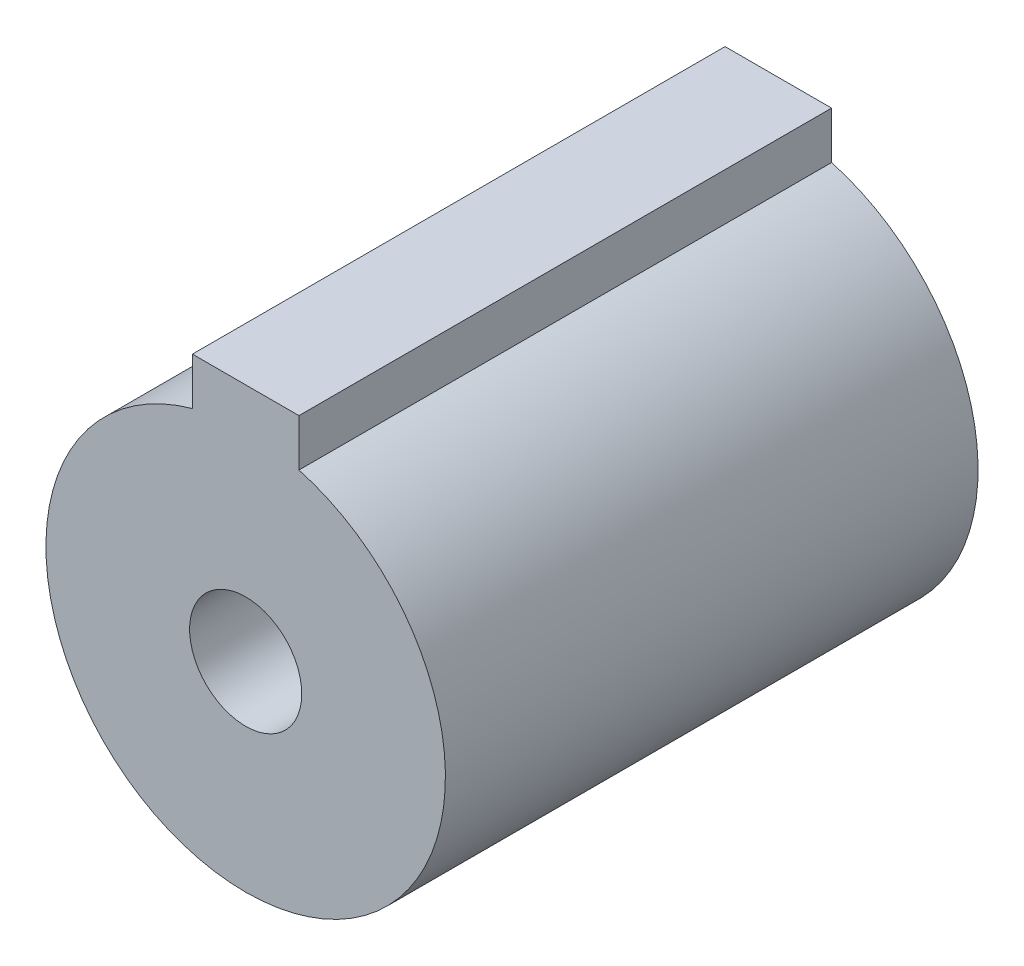
ISO-10303-21;
HEADER;
FILE_DESCRIPTION(('STEP AP214'),'2;1');
FILE_NAME('part.step','',(''),(''),'','','');
FILE_SCHEMA(('AUTOMOTIVE_DESIGN { 1 0 10303 214 1 1 1 1 }'));
ENDSEC;
DATA;
#1=APPLICATION_CONTEXT('core data for automotive mechanical design processes');
#2=APPLICATION_PROTOCOL_DEFINITION('international standard','automotive_design',2000,#1);
#3=PRODUCT_CONTEXT('',#1,'mechanical');
#4=PRODUCT('Part','Part','',(#3));
#5=PRODUCT_RELATED_PRODUCT_CATEGORY('part','',(#4));
#6=PRODUCT_DEFINITION_FORMATION('','',#4);
#7=PRODUCT_DEFINITION_CONTEXT('part definition',#1,'design');
#8=PRODUCT_DEFINITION('design','',#6,#7);
#9=PRODUCT_DEFINITION_SHAPE('','',#8);
#10=(LENGTH_UNIT() NAMED_UNIT(*) SI_UNIT(.MILLI.,.METRE.));
#11=(NAMED_UNIT(*) PLANE_ANGLE_UNIT() SI_UNIT($,.RADIAN.));
#12=(NAMED_UNIT(*) SI_UNIT($,.STERADIAN.) SOLID_ANGLE_UNIT());
#13=UNCERTAINTY_MEASURE_WITH_UNIT(LENGTH_MEASURE(1.E-05),#10,'distance_accuracy_value','');
#14=(GEOMETRIC_REPRESENTATION_CONTEXT(3) GLOBAL_UNCERTAINTY_ASSIGNED_CONTEXT((#13)) GLOBAL_UNIT_ASSIGNED_CONTEXT((#10,
#11,#12)) REPRESENTATION_CONTEXT('',''));
#15=CARTESIAN_POINT('',(0.,0.,0.));
#16=DIRECTION('',(0.,0.,1.));
#17=DIRECTION('',(1.,0.,0.));
#18=AXIS2_PLACEMENT_3D('',#15,#16,#17);
#19=CARTESIAN_POINT('',(-4.,14.456832294801,40.));
#20=DIRECTION('',(1.,0.,0.));
#21=DIRECTION('',(0.,0.,-1.));
#22=AXIS2_PLACEMENT_3D('',#19,#20,#21);
#23=PLANE('',#22);
#24=DIRECTION('',(0.,-1.,0.));
#25=VECTOR('',#24,1.);
#26=CARTESIAN_POINT('',(-4.,14.456832294801,0.));
#27=LINE('',#26,#25);
#28=CARTESIAN_POINT('',(-4.,17.996832294801,0.));
#29=VERTEX_POINT('',#28);
#30=CARTESIAN_POINT('',(-4.,14.456832294801,0.));
#31=VERTEX_POINT('',#30);
#32=EDGE_CURVE('E101',#29,#31,#27,.T.);
#33=ORIENTED_EDGE('',*,*,#32,.T.);
#34=DIRECTION('',(0.,0.,-1.));
#35=VECTOR('',#34,1.);
#36=CARTESIAN_POINT('',(-4.,14.456832294801,40.));
#37=LINE('',#36,#35);
#38=CARTESIAN_POINT('',(-4.,14.456832294801,40.));
#39=VERTEX_POINT('',#38);
#40=EDGE_CURVE('E11',#39,#31,#37,.T.);
#41=ORIENTED_EDGE('',*,*,#40,.F.);
#42=DIRECTION('',(0.,-1.,0.));
#43=VECTOR('',#42,1.);
#44=CARTESIAN_POINT('',(-4.,14.456832294801,40.));
#45=LINE('',#44,#43);
#46=CARTESIAN_POINT('',(-4.,17.996832294801,40.));
#47=VERTEX_POINT('',#46);
#48=EDGE_CURVE('E89',#47,#39,#45,.T.);
#49=ORIENTED_EDGE('',*,*,#48,.F.);
#50=DIRECTION('',(0.,0.,-1.));
#51=VECTOR('',#50,1.);
#52=CARTESIAN_POINT('',(-4.,17.996832294801,40.));
#53=LINE('',#52,#51);
#54=EDGE_CURVE('E97',#47,#29,#53,.T.);
#55=ORIENTED_EDGE('',*,*,#54,.T.);
#56=EDGE_LOOP('',(#33,#41,#49,#55));
#57=FACE_BOUND('',#56,.T.);
#58=ADVANCED_FACE('F38',(#57),#23,.F.);
#59=CARTESIAN_POINT('',(0.,0.,40.));
#60=DIRECTION('',(0.,0.,-1.));
#61=DIRECTION('',(-1.,0.,0.));
#62=AXIS2_PLACEMENT_3D('',#59,#60,#61);
#63=CYLINDRICAL_SURFACE('',#62,15.);
#64=CARTESIAN_POINT('',(0.,0.,0.));
#65=DIRECTION('',(0.,0.,1.));
#66=DIRECTION('',(1.,0.,0.));
#67=AXIS2_PLACEMENT_3D('',#64,#65,#66);
#68=CIRCLE('',#67,15.);
#69=CARTESIAN_POINT('',(4.,14.456832294801,0.));
#70=VERTEX_POINT('',#69);
#71=EDGE_CURVE('E93',#31,#70,#68,.T.);
#72=ORIENTED_EDGE('',*,*,#71,.T.);
#73=DIRECTION('',(0.,0.,-1.));
#74=VECTOR('',#73,1.);
#75=CARTESIAN_POINT('',(4.,14.456832294801,40.));
#76=LINE('',#75,#74);
#77=CARTESIAN_POINT('',(4.,14.456832294801,40.));
#78=VERTEX_POINT('',#77);
#79=EDGE_CURVE('E46',#78,#70,#76,.T.);
#80=ORIENTED_EDGE('',*,*,#79,.F.);
#81=CARTESIAN_POINT('',(0.,0.,40.));
#82=DIRECTION('',(0.,0.,1.));
#83=DIRECTION('',(1.,0.,0.));
#84=AXIS2_PLACEMENT_3D('',#81,#82,#83);
#85=CIRCLE('',#84,15.);
#86=EDGE_CURVE('E84',#39,#78,#85,.T.);
#87=ORIENTED_EDGE('',*,*,#86,.F.);
#88=ORIENTED_EDGE('',*,*,#40,.T.);
#89=EDGE_LOOP('',(#72,#80,#87,#88));
#90=FACE_BOUND('',#89,.T.);
#91=ADVANCED_FACE('F92',(#90),#63,.T.);
#92=CARTESIAN_POINT('',(4.,14.456832294801,40.));
#93=DIRECTION('',(-1.,0.,0.));
#94=DIRECTION('',(0.,0.,1.));
#95=AXIS2_PLACEMENT_3D('',#92,#93,#94);
#96=PLANE('',#95);
#97=DIRECTION('',(0.,1.,0.));
#98=VECTOR('',#97,1.);
#99=CARTESIAN_POINT('',(4.,14.456832294801,0.));
#100=LINE('',#99,#98);
#101=CARTESIAN_POINT('',(4.,17.996832294801,0.));
#102=VERTEX_POINT('',#101);
#103=EDGE_CURVE('E71',#70,#102,#100,.T.);
#104=ORIENTED_EDGE('',*,*,#103,.T.);
#105=DIRECTION('',(0.,0.,-1.));
#106=VECTOR('',#105,1.);
#107=CARTESIAN_POINT('',(4.,17.996832294801,40.));
#108=LINE('',#107,#106);
#109=CARTESIAN_POINT('',(4.,17.996832294801,40.));
#110=VERTEX_POINT('',#109);
#111=EDGE_CURVE('E94',#110,#102,#108,.T.);
#112=ORIENTED_EDGE('',*,*,#111,.F.);
#113=DIRECTION('',(0.,1.,0.));
#114=VECTOR('',#113,1.);
#115=CARTESIAN_POINT('',(4.,14.456832294801,40.));
#116=LINE('',#115,#114);
#117=EDGE_CURVE('E87',#78,#110,#116,.T.);
#118=ORIENTED_EDGE('',*,*,#117,.F.);
#119=ORIENTED_EDGE('',*,*,#79,.T.);
#120=EDGE_LOOP('',(#104,#112,#118,#119));
#121=FACE_BOUND('',#120,.T.);
#122=ADVANCED_FACE('F95',(#121),#96,.F.);
#123=CARTESIAN_POINT('',(4.,17.996832294801,40.));
#124=DIRECTION('',(0.,-1.,0.));
#125=DIRECTION('',(1.,0.,0.));
#126=AXIS2_PLACEMENT_3D('',#123,#124,#125);
#127=PLANE('',#126);
#128=DIRECTION('',(-1.,0.,0.));
#129=VECTOR('',#128,1.);
#130=CARTESIAN_POINT('',(4.,17.996832294801,0.));
#131=LINE('',#130,#129);
#132=EDGE_CURVE('E77',#102,#29,#131,.T.);
#133=ORIENTED_EDGE('',*,*,#132,.T.);
#134=ORIENTED_EDGE('',*,*,#54,.F.);
#135=DIRECTION('',(-1.,0.,0.));
#136=VECTOR('',#135,1.);
#137=CARTESIAN_POINT('',(4.,17.996832294801,40.));
#138=LINE('',#137,#136);
#139=EDGE_CURVE('E54',#110,#47,#138,.T.);
#140=ORIENTED_EDGE('',*,*,#139,.F.);
#141=ORIENTED_EDGE('',*,*,#111,.T.);
#142=EDGE_LOOP('',(#133,#134,#140,#141));
#143=FACE_BOUND('',#142,.T.);
#144=ADVANCED_FACE('F109',(#143),#127,.F.);
#145=CARTESIAN_POINT('',(0.,0.,40.));
#146=DIRECTION('',(0.,0.,1.));
#147=DIRECTION('',(1.,0.,0.));
#148=AXIS2_PLACEMENT_3D('',#145,#146,#147);
#149=PLANE('',#148);
#150=CARTESIAN_POINT('',(0.,0.,40.));
#151=DIRECTION('',(0.,0.,1.));
#152=DIRECTION('',(1.,0.,0.));
#153=AXIS2_PLACEMENT_3D('',#150,#151,#152);
#154=CIRCLE('',#153,4.21);
#155=CARTESIAN_POINT('',(4.21,0.,40.));
#156=VERTEX_POINT('',#155);
#157=EDGE_CURVE('E115',#156,#156,#154,.T.);
#158=ORIENTED_EDGE('',*,*,#157,.F.);
#159=EDGE_LOOP('',(#158));
#160=FACE_BOUND('',#159,.T.);
#161=ORIENTED_EDGE('',*,*,#48,.T.);
#162=ORIENTED_EDGE('',*,*,#86,.T.);
#163=ORIENTED_EDGE('',*,*,#117,.T.);
#164=ORIENTED_EDGE('',*,*,#139,.T.);
#165=EDGE_LOOP('',(#161,#162,#163,#164));
#166=FACE_BOUND('',#165,.T.);
#167=ADVANCED_FACE('F85',(#160,#166),#149,.T.);
#168=CARTESIAN_POINT('',(0.,0.,0.));
#169=DIRECTION('',(0.,0.,1.));
#170=DIRECTION('',(1.,0.,0.));
#171=AXIS2_PLACEMENT_3D('',#168,#169,#170);
#172=PLANE('',#171);
#173=CARTESIAN_POINT('',(0.,0.,0.));
#174=DIRECTION('',(0.,0.,1.));
#175=DIRECTION('',(1.,0.,0.));
#176=AXIS2_PLACEMENT_3D('',#173,#174,#175);
#177=CIRCLE('',#176,4.21);
#178=CARTESIAN_POINT('',(4.21,0.,0.));
#179=VERTEX_POINT('',#178);
#180=EDGE_CURVE('E104',#179,#179,#177,.T.);
#181=ORIENTED_EDGE('',*,*,#180,.T.);
#182=EDGE_LOOP('',(#181));
#183=FACE_BOUND('',#182,.T.);
#184=ORIENTED_EDGE('',*,*,#32,.F.);
#185=ORIENTED_EDGE('',*,*,#132,.F.);
#186=ORIENTED_EDGE('',*,*,#103,.F.);
#187=ORIENTED_EDGE('',*,*,#71,.F.);
#188=EDGE_LOOP('',(#184,#185,#186,#187));
#189=FACE_BOUND('',#188,.T.);
#190=ADVANCED_FACE('F112',(#183,#189),#172,.F.);
#191=CARTESIAN_POINT('',(0.,0.,0.));
#192=DIRECTION('',(0.,0.,1.));
#193=DIRECTION('',(1.,0.,0.));
#194=AXIS2_PLACEMENT_3D('',#191,#192,#193);
#195=CYLINDRICAL_SURFACE('',#194,4.21);
#196=ORIENTED_EDGE('',*,*,#180,.F.);
#197=EDGE_LOOP('',(#196));
#198=FACE_BOUND('',#197,.T.);
#199=ORIENTED_EDGE('',*,*,#157,.T.);
#200=EDGE_LOOP('',(#199));
#201=FACE_BOUND('',#200,.T.);
#202=ADVANCED_FACE('F122',(#198,#201),#195,.F.);
#203=CLOSED_SHELL('',(#58,#91,#122,#144,#167,#190,#202));
#204=MANIFOLD_SOLID_BREP('B2',#203);
#205=ADVANCED_BREP_SHAPE_REPRESENTATION('',(#18,#204),#14);
#206=SHAPE_DEFINITION_REPRESENTATION(#9,#205);
ENDSEC;
END-ISO-10303-21;
